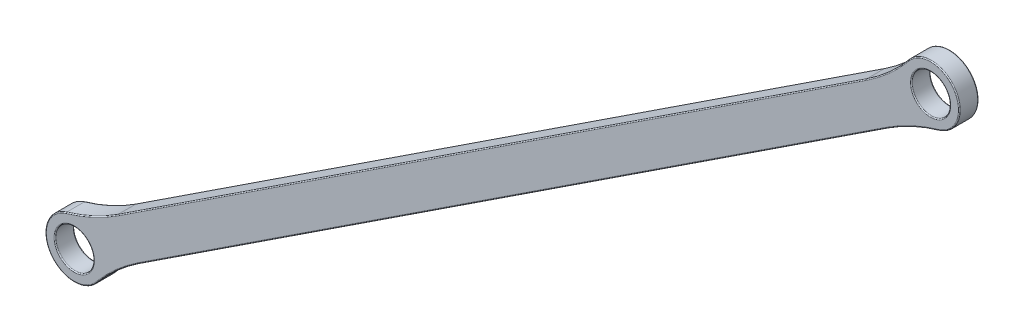
ISO-10303-21;
HEADER;
FILE_DESCRIPTION(('STEP AP214'),'2;1');
FILE_NAME('part.step','',(''),(''),'','','');
FILE_SCHEMA(('AUTOMOTIVE_DESIGN { 1 0 10303 214 1 1 1 1 }'));
ENDSEC;
DATA;
#1=APPLICATION_CONTEXT('core data for automotive mechanical design processes');
#2=APPLICATION_PROTOCOL_DEFINITION('international standard','automotive_design',2000,#1);
#3=PRODUCT_CONTEXT('',#1,'mechanical');
#4=PRODUCT('Part','Part','',(#3));
#5=PRODUCT_RELATED_PRODUCT_CATEGORY('part','',(#4));
#6=PRODUCT_DEFINITION_FORMATION('','',#4);
#7=PRODUCT_DEFINITION_CONTEXT('part definition',#1,'design');
#8=PRODUCT_DEFINITION('design','',#6,#7);
#9=PRODUCT_DEFINITION_SHAPE('','',#8);
#10=(LENGTH_UNIT() NAMED_UNIT(*) SI_UNIT(.MILLI.,.METRE.));
#11=(NAMED_UNIT(*) PLANE_ANGLE_UNIT() SI_UNIT($,.RADIAN.));
#12=(NAMED_UNIT(*) SI_UNIT($,.STERADIAN.) SOLID_ANGLE_UNIT());
#13=UNCERTAINTY_MEASURE_WITH_UNIT(LENGTH_MEASURE(1.E-05),#10,'distance_accuracy_value','');
#14=(GEOMETRIC_REPRESENTATION_CONTEXT(3) GLOBAL_UNCERTAINTY_ASSIGNED_CONTEXT((#13)) GLOBAL_UNIT_ASSIGNED_CONTEXT((#10,
#11,#12)) REPRESENTATION_CONTEXT('',''));
#15=CARTESIAN_POINT('',(0.,0.,0.));
#16=DIRECTION('',(0.,0.,1.));
#17=DIRECTION('',(1.,0.,0.));
#18=AXIS2_PLACEMENT_3D('',#15,#16,#17);
#19=CARTESIAN_POINT('',(-132.474102125265,201.706287235754,-3.));
#20=DIRECTION('',(0.548958656898151,-0.835849503808298,0.));
#21=DIRECTION('',(0.835849503808298,0.548958656898151,0.));
#22=AXIS2_PLACEMENT_3D('',#19,#20,#21);
#23=PLANE('',#22);
#24=DIRECTION('',(0.,0.,1.));
#25=VECTOR('',#24,1.);
#26=CARTESIAN_POINT('',(-101.185486117817,222.255628404699,-3.));
#27=LINE('',#26,#25);
#28=CARTESIAN_POINT('',(-101.185486117817,222.255628404699,-0.15));
#29=VERTEX_POINT('',#28);
#30=CARTESIAN_POINT('',(-101.185486117817,222.255628404699,-2.85));
#31=VERTEX_POINT('',#30);
#32=EDGE_CURVE('E314',#29,#31,#27,.F.);
#33=ORIENTED_EDGE('',*,*,#32,.T.);
#34=DIRECTION('',(0.835849503808298,0.548958656898151,0.));
#35=VECTOR('',#34,1.);
#36=CARTESIAN_POINT('',(-132.474102125265,201.706287235754,-2.85));
#37=LINE('',#36,#35);
#38=CARTESIAN_POINT('',(-218.100259941872,145.469823163946,-2.85));
#39=VERTEX_POINT('',#38);
#40=EDGE_CURVE('E214',#31,#39,#37,.F.);
#41=ORIENTED_EDGE('',*,*,#40,.T.);
#42=DIRECTION('',(0.,0.,1.));
#43=VECTOR('',#42,1.);
#44=CARTESIAN_POINT('',(-218.100259941872,145.469823163946,-3.));
#45=LINE('',#44,#43);
#46=CARTESIAN_POINT('',(-218.100259941872,145.469823163946,-0.15));
#47=VERTEX_POINT('',#46);
#48=EDGE_CURVE('E317',#39,#47,#45,.T.);
#49=ORIENTED_EDGE('',*,*,#48,.T.);
#50=DIRECTION('',(0.835849503808298,0.548958656898151,0.));
#51=VECTOR('',#50,1.);
#52=CARTESIAN_POINT('',(-101.185486117817,222.255628404699,-0.15));
#53=LINE('',#52,#51);
#54=EDGE_CURVE('E212',#47,#29,#53,.T.);
#55=ORIENTED_EDGE('',*,*,#54,.T.);
#56=EDGE_LOOP('',(#33,#41,#49,#55));
#57=FACE_BOUND('',#56,.T.);
#58=ADVANCED_FACE('F34',(#57),#23,.F.);
#59=CARTESIAN_POINT('',(-91.1280367544865,225.27186982475,-3.));
#60=DIRECTION('',(0.,0.,1.));
#61=DIRECTION('',(1.,0.,0.));
#62=AXIS2_PLACEMENT_3D('',#59,#60,#61);
#63=CYLINDRICAL_SURFACE('',#62,4.49999999999999);
#64=DIRECTION('',(0.,0.,1.));
#65=VECTOR('',#64,1.);
#66=CARTESIAN_POINT('',(-89.8621590651384,220.953588491208,-3.));
#67=LINE('',#66,#65);
#68=CARTESIAN_POINT('',(-89.8621590651384,220.953588491208,-0.15));
#69=VERTEX_POINT('',#68);
#70=CARTESIAN_POINT('',(-89.8621590651384,220.953588491208,-2.85));
#71=VERTEX_POINT('',#70);
#72=EDGE_CURVE('E311',#69,#71,#67,.F.);
#73=ORIENTED_EDGE('',*,*,#72,.T.);
#74=CARTESIAN_POINT('',(-91.1280367544865,225.27186982475,-2.85));
#75=DIRECTION('',(0.,0.,1.));
#76=DIRECTION('',(1.,0.,0.));
#77=AXIS2_PLACEMENT_3D('',#74,#75,#76);
#78=CIRCLE('',#77,4.49999999999999);
#79=CARTESIAN_POINT('',(-94.5879770680007,228.149162480515,-2.85));
#80=VERTEX_POINT('',#79);
#81=EDGE_CURVE('E205',#71,#80,#78,.T.);
#82=ORIENTED_EDGE('',*,*,#81,.T.);
#83=DIRECTION('',(0.,0.,1.));
#84=VECTOR('',#83,1.);
#85=CARTESIAN_POINT('',(-94.5879770680007,228.149162480515,-3.));
#86=LINE('',#85,#84);
#87=CARTESIAN_POINT('',(-94.5879770680007,228.149162480515,-0.15));
#88=VERTEX_POINT('',#87);
#89=EDGE_CURVE('E308',#80,#88,#86,.T.);
#90=ORIENTED_EDGE('',*,*,#89,.T.);
#91=CARTESIAN_POINT('',(-91.1280367544865,225.27186982475,-0.15));
#92=DIRECTION('',(0.,0.,1.));
#93=DIRECTION('',(1.,0.,0.));
#94=AXIS2_PLACEMENT_3D('',#91,#92,#93);
#95=CIRCLE('',#94,4.49999999999999);
#96=EDGE_CURVE('E203',#88,#69,#95,.F.);
#97=ORIENTED_EDGE('',*,*,#96,.T.);
#98=EDGE_LOOP('',(#73,#82,#90,#97));
#99=FACE_BOUND('',#98,.T.);
#100=ADVANCED_FACE('F386',(#99),#63,.T.);
#101=CARTESIAN_POINT('',(-129.180350183876,196.691190212904,-3.));
#102=DIRECTION('',(0.548958656898151,-0.835849503808298,0.));
#103=DIRECTION('',(0.835849503808298,0.548958656898151,0.));
#104=AXIS2_PLACEMENT_3D('',#101,#102,#103);
#105=PLANE('',#104);
#106=DIRECTION('',(0.,0.,-1.));
#107=VECTOR('',#106,1.);
#108=CARTESIAN_POINT('',(-214.806508000483,140.454726141096,-3.));
#109=LINE('',#108,#107);
#110=CARTESIAN_POINT('',(-214.806508000483,140.454726141096,-0.15));
#111=VERTEX_POINT('',#110);
#112=CARTESIAN_POINT('',(-214.806508000483,140.454726141096,-2.85));
#113=VERTEX_POINT('',#112);
#114=EDGE_CURVE('E296',#111,#113,#109,.T.);
#115=ORIENTED_EDGE('',*,*,#114,.T.);
#116=DIRECTION('',(0.835849503808298,0.548958656898151,0.));
#117=VECTOR('',#116,1.);
#118=CARTESIAN_POINT('',(-97.8917341764288,217.240531381849,-2.85));
#119=LINE('',#118,#117);
#120=CARTESIAN_POINT('',(-97.8917341764288,217.240531381849,-2.85));
#121=VERTEX_POINT('',#120);
#122=EDGE_CURVE('E197',#113,#121,#119,.T.);
#123=ORIENTED_EDGE('',*,*,#122,.T.);
#124=DIRECTION('',(0.,0.,-1.));
#125=VECTOR('',#124,1.);
#126=CARTESIAN_POINT('',(-97.8917341764288,217.240531381849,0.));
#127=LINE('',#126,#125);
#128=CARTESIAN_POINT('',(-97.8917341764288,217.240531381849,-0.15));
#129=VERTEX_POINT('',#128);
#130=EDGE_CURVE('E301',#121,#129,#127,.F.);
#131=ORIENTED_EDGE('',*,*,#130,.T.);
#132=DIRECTION('',(0.835849503808298,0.548958656898151,0.));
#133=VECTOR('',#132,1.);
#134=CARTESIAN_POINT('',(-129.180350183876,196.691190212904,-0.15));
#135=LINE('',#134,#133);
#136=EDGE_CURVE('E195',#129,#111,#135,.F.);
#137=ORIENTED_EDGE('',*,*,#136,.T.);
#138=EDGE_LOOP('',(#115,#123,#131,#137));
#139=FACE_BOUND('',#138,.T.);
#140=ADVANCED_FACE('F343',(#139),#105,.T.);
#141=CARTESIAN_POINT('',(-91.1280367544865,225.27186982475,-3.));
#142=DIRECTION('',(0.,0.,1.));
#143=DIRECTION('',(1.,0.,0.));
#144=AXIS2_PLACEMENT_3D('',#141,#142,#143);
#145=CYLINDRICAL_SURFACE('',#144,3.00000000000002);
#146=CARTESIAN_POINT('',(-91.1280367544865,225.27186982475,-2.85));
#147=DIRECTION('',(0.,0.,1.));
#148=DIRECTION('',(1.,0.,0.));
#149=AXIS2_PLACEMENT_3D('',#146,#147,#148);
#150=CIRCLE('',#149,3.00000000000002);
#151=CARTESIAN_POINT('',(-88.1280367544865,225.27186982475,-2.85));
#152=VERTEX_POINT('',#151);
#153=EDGE_CURVE('E189',#152,#152,#150,.F.);
#154=ORIENTED_EDGE('',*,*,#153,.T.);
#155=EDGE_LOOP('',(#154));
#156=FACE_BOUND('',#155,.T.);
#157=CARTESIAN_POINT('',(-91.1280367544865,225.27186982475,-0.15));
#158=DIRECTION('',(0.,0.,1.));
#159=DIRECTION('',(1.,0.,0.));
#160=AXIS2_PLACEMENT_3D('',#157,#158,#159);
#161=CIRCLE('',#160,3.00000000000002);
#162=CARTESIAN_POINT('',(-88.1280367544865,225.27186982475,-0.15));
#163=VERTEX_POINT('',#162);
#164=EDGE_CURVE('E186',#163,#163,#161,.T.);
#165=ORIENTED_EDGE('',*,*,#164,.T.);
#166=EDGE_LOOP('',(#165));
#167=FACE_BOUND('',#166,.T.);
#168=ADVANCED_FACE('F393',(#156,#167),#145,.F.);
#169=CARTESIAN_POINT('',(-224.863957363814,137.438484721045,-3.));
#170=DIRECTION('',(0.,0.,1.));
#171=DIRECTION('',(1.,0.,0.));
#172=AXIS2_PLACEMENT_3D('',#169,#170,#171);
#173=CYLINDRICAL_SURFACE('',#172,4.50000000000002);
#174=DIRECTION('',(0.,0.,1.));
#175=VECTOR('',#174,1.);
#176=CARTESIAN_POINT('',(-226.129835053162,141.756766054587,-3.));
#177=LINE('',#176,#175);
#178=CARTESIAN_POINT('',(-226.129835053162,141.756766054587,-0.15));
#179=VERTEX_POINT('',#178);
#180=CARTESIAN_POINT('',(-226.129835053162,141.756766054587,-2.85));
#181=VERTEX_POINT('',#180);
#182=EDGE_CURVE('E257',#179,#181,#177,.F.);
#183=ORIENTED_EDGE('',*,*,#182,.T.);
#184=CARTESIAN_POINT('',(-224.863957363814,137.438484721045,-2.85));
#185=DIRECTION('',(0.,0.,1.));
#186=DIRECTION('',(1.,0.,0.));
#187=AXIS2_PLACEMENT_3D('',#184,#185,#186);
#188=CIRCLE('',#187,4.50000000000002);
#189=CARTESIAN_POINT('',(-221.4040170503,134.56119206528,-2.85));
#190=VERTEX_POINT('',#189);
#191=EDGE_CURVE('E222',#181,#190,#188,.T.);
#192=ORIENTED_EDGE('',*,*,#191,.T.);
#193=DIRECTION('',(0.,0.,1.));
#194=VECTOR('',#193,1.);
#195=CARTESIAN_POINT('',(-221.4040170503,134.56119206528,-3.));
#196=LINE('',#195,#194);
#197=CARTESIAN_POINT('',(-221.4040170503,134.56119206528,-0.15));
#198=VERTEX_POINT('',#197);
#199=EDGE_CURVE('E294',#190,#198,#196,.T.);
#200=ORIENTED_EDGE('',*,*,#199,.T.);
#201=CARTESIAN_POINT('',(-224.863957363814,137.438484721045,-0.15));
#202=DIRECTION('',(0.,0.,1.));
#203=DIRECTION('',(1.,0.,0.));
#204=AXIS2_PLACEMENT_3D('',#201,#202,#203);
#205=CIRCLE('',#204,4.50000000000002);
#206=EDGE_CURVE('E220',#198,#179,#205,.F.);
#207=ORIENTED_EDGE('',*,*,#206,.T.);
#208=EDGE_LOOP('',(#183,#192,#200,#207));
#209=FACE_BOUND('',#208,.T.);
#210=ADVANCED_FACE('F299',(#209),#173,.T.);
#211=CARTESIAN_POINT('',(-224.863957363814,137.438484721045,-3.));
#212=DIRECTION('',(0.,0.,1.));
#213=DIRECTION('',(1.,0.,0.));
#214=AXIS2_PLACEMENT_3D('',#211,#212,#213);
#215=CYLINDRICAL_SURFACE('',#214,3.00000000000002);
#216=CARTESIAN_POINT('',(-224.863957363814,137.438484721045,-2.85));
#217=DIRECTION('',(0.,0.,1.));
#218=DIRECTION('',(1.,0.,0.));
#219=AXIS2_PLACEMENT_3D('',#216,#217,#218);
#220=CIRCLE('',#219,3.00000000000002);
#221=CARTESIAN_POINT('',(-221.863957363814,137.438484721045,-2.85));
#222=VERTEX_POINT('',#221);
#223=EDGE_CURVE('E169',#222,#222,#220,.F.);
#224=ORIENTED_EDGE('',*,*,#223,.T.);
#225=EDGE_LOOP('',(#224));
#226=FACE_BOUND('',#225,.T.);
#227=CARTESIAN_POINT('',(-224.863957363814,137.438484721045,-0.15));
#228=DIRECTION('',(0.,0.,1.));
#229=DIRECTION('',(1.,0.,0.));
#230=AXIS2_PLACEMENT_3D('',#227,#228,#229);
#231=CIRCLE('',#230,3.00000000000002);
#232=CARTESIAN_POINT('',(-221.863957363814,137.438484721045,-0.15));
#233=VERTEX_POINT('',#232);
#234=EDGE_CURVE('E320',#233,#233,#231,.T.);
#235=ORIENTED_EDGE('',*,*,#234,.T.);
#236=EDGE_LOOP('',(#235));
#237=FACE_BOUND('',#236,.T.);
#238=ADVANCED_FACE('F400',(#226,#237),#215,.F.);
#239=CARTESIAN_POINT('',(0.,0.,-3.));
#240=DIRECTION('',(0.,0.,1.));
#241=DIRECTION('',(1.,0.,0.));
#242=AXIS2_PLACEMENT_3D('',#239,#240,#241);
#243=PLANE('',#242);
#244=CARTESIAN_POINT('',(-224.863957363814,137.438484721045,-3.));
#245=DIRECTION('',(0.,0.,1.));
#246=DIRECTION('',(1.,0.,0.));
#247=AXIS2_PLACEMENT_3D('',#244,#245,#246);
#248=CIRCLE('',#247,3.15000000000002);
#249=CARTESIAN_POINT('',(-221.713957363814,137.438484721045,-3.));
#250=VERTEX_POINT('',#249);
#251=EDGE_CURVE('E178',#250,#250,#248,.T.);
#252=ORIENTED_EDGE('',*,*,#251,.T.);
#253=EDGE_LOOP('',(#252));
#254=FACE_BOUND('',#253,.T.);
#255=CARTESIAN_POINT('',(-91.1280367544865,225.27186982475,-3.));
#256=DIRECTION('',(0.,0.,1.));
#257=DIRECTION('',(1.,0.,0.));
#258=AXIS2_PLACEMENT_3D('',#255,#256,#257);
#259=CIRCLE('',#258,3.15000000000002);
#260=CARTESIAN_POINT('',(-87.9780367544865,225.27186982475,-3.));
#261=VERTEX_POINT('',#260);
#262=EDGE_CURVE('E175',#261,#261,#259,.T.);
#263=ORIENTED_EDGE('',*,*,#262,.T.);
#264=EDGE_LOOP('',(#263));
#265=FACE_BOUND('',#264,.T.);
#266=DIRECTION('',(0.835849503808298,0.548958656898151,0.));
#267=VECTOR('',#266,1.);
#268=CARTESIAN_POINT('',(-214.888851799018,140.580103566668,-3.));
#269=LINE('',#268,#267);
#270=CARTESIAN_POINT('',(-97.9740779749635,217.36590880742,-3.));
#271=VERTEX_POINT('',#270);
#272=CARTESIAN_POINT('',(-214.888851799018,140.580103566668,-3.));
#273=VERTEX_POINT('',#272);
#274=EDGE_CURVE('E173',#271,#273,#269,.F.);
#275=ORIENTED_EDGE('',*,*,#274,.T.);
#276=CARTESIAN_POINT('',(-198.337748293538,115.379241026847,-3.));
#277=DIRECTION('',(0.,0.,1.));
#278=DIRECTION('',(1.,0.,0.));
#279=AXIS2_PLACEMENT_3D('',#276,#277,#278);
#280=CIRCLE('',#279,30.15);
#281=CARTESIAN_POINT('',(-221.519348394084,134.657101820473,-3.));
#282=VERTEX_POINT('',#281);
#283=EDGE_CURVE('E154',#273,#282,#280,.T.);
#284=ORIENTED_EDGE('',*,*,#283,.T.);
#285=CARTESIAN_POINT('',(-224.863957363814,137.438484721045,-3.));
#286=DIRECTION('',(0.,0.,1.));
#287=DIRECTION('',(1.,0.,0.));
#288=AXIS2_PLACEMENT_3D('',#285,#286,#287);
#289=CIRCLE('',#288,4.35000000000002);
#290=CARTESIAN_POINT('',(-226.087639130184,141.612823343469,-3.));
#291=VERTEX_POINT('',#290);
#292=EDGE_CURVE('E162',#282,#291,#289,.F.);
#293=ORIENTED_EDGE('',*,*,#292,.T.);
#294=CARTESIAN_POINT('',(-234.569019648817,170.545308278195,-3.));
#295=DIRECTION('',(0.,0.,1.));
#296=DIRECTION('',(1.,0.,0.));
#297=AXIS2_PLACEMENT_3D('',#294,#295,#296);
#298=CIRCLE('',#297,30.15);
#299=CARTESIAN_POINT('',(-218.017916143337,145.344445738375,-3.));
#300=VERTEX_POINT('',#299);
#301=EDGE_CURVE('E168',#291,#300,#298,.T.);
#302=ORIENTED_EDGE('',*,*,#301,.T.);
#303=DIRECTION('',(0.835849503808298,0.548958656898151,0.));
#304=VECTOR('',#303,1.);
#305=CARTESIAN_POINT('',(-132.39175832673,201.580909810183,-3.));
#306=LINE('',#305,#304);
#307=CARTESIAN_POINT('',(-101.103142319283,222.130250979128,-3.));
#308=VERTEX_POINT('',#307);
#309=EDGE_CURVE('E326',#300,#308,#306,.T.);
#310=ORIENTED_EDGE('',*,*,#309,.T.);
#311=CARTESIAN_POINT('',(-117.654245824762,247.331113518948,-3.));
#312=DIRECTION('',(0.,0.,1.));
#313=DIRECTION('',(1.,0.,0.));
#314=AXIS2_PLACEMENT_3D('',#311,#312,#313);
#315=CIRCLE('',#314,30.15);
#316=CARTESIAN_POINT('',(-94.4726457242169,228.053252725322,-3.));
#317=VERTEX_POINT('',#316);
#318=EDGE_CURVE('E328',#308,#317,#315,.T.);
#319=ORIENTED_EDGE('',*,*,#318,.T.);
#320=CARTESIAN_POINT('',(-91.1280367544865,225.27186982475,-3.));
#321=DIRECTION('',(0.,0.,1.));
#322=DIRECTION('',(1.,0.,0.));
#323=AXIS2_PLACEMENT_3D('',#320,#321,#322);
#324=CIRCLE('',#323,4.34999999999999);
#325=CARTESIAN_POINT('',(-89.9043549881166,221.097531202326,-3.));
#326=VERTEX_POINT('',#325);
#327=EDGE_CURVE('E330',#317,#326,#324,.F.);
#328=ORIENTED_EDGE('',*,*,#327,.T.);
#329=CARTESIAN_POINT('',(-81.4229744694843,192.1650462676,-3.));
#330=DIRECTION('',(0.,0.,1.));
#331=DIRECTION('',(1.,0.,0.));
#332=AXIS2_PLACEMENT_3D('',#329,#330,#331);
#333=CIRCLE('',#332,30.15);
#334=EDGE_CURVE('E180',#326,#271,#333,.T.);
#335=ORIENTED_EDGE('',*,*,#334,.T.);
#336=EDGE_LOOP('',(#275,#284,#293,#302,#310,#319,#328,#335));
#337=FACE_BOUND('',#336,.T.);
#338=ADVANCED_FACE('F171',(#254,#265,#337),#243,.F.);
#339=CARTESIAN_POINT('',(0.,0.,0.));
#340=DIRECTION('',(0.,0.,1.));
#341=DIRECTION('',(1.,0.,0.));
#342=AXIS2_PLACEMENT_3D('',#339,#340,#341);
#343=PLANE('',#342);
#344=CARTESIAN_POINT('',(-224.863957363814,137.438484721045,0.));
#345=DIRECTION('',(0.,0.,1.));
#346=DIRECTION('',(1.,0.,0.));
#347=AXIS2_PLACEMENT_3D('',#344,#345,#346);
#348=CIRCLE('',#347,3.15000000000002);
#349=CARTESIAN_POINT('',(-221.713957363814,137.438484721045,0.));
#350=VERTEX_POINT('',#349);
#351=EDGE_CURVE('E11',#350,#350,#348,.F.);
#352=ORIENTED_EDGE('',*,*,#351,.T.);
#353=EDGE_LOOP('',(#352));
#354=FACE_BOUND('',#353,.T.);
#355=CARTESIAN_POINT('',(-91.1280367544865,225.27186982475,0.));
#356=DIRECTION('',(0.,0.,1.));
#357=DIRECTION('',(1.,0.,0.));
#358=AXIS2_PLACEMENT_3D('',#355,#356,#357);
#359=CIRCLE('',#358,3.15000000000002);
#360=CARTESIAN_POINT('',(-87.9780367544865,225.27186982475,0.));
#361=VERTEX_POINT('',#360);
#362=EDGE_CURVE('E43',#361,#361,#359,.F.);
#363=ORIENTED_EDGE('',*,*,#362,.T.);
#364=EDGE_LOOP('',(#363));
#365=FACE_BOUND('',#364,.T.);
#366=CARTESIAN_POINT('',(-91.1280367544865,225.27186982475,0.));
#367=DIRECTION('',(0.,0.,1.));
#368=DIRECTION('',(1.,0.,0.));
#369=AXIS2_PLACEMENT_3D('',#366,#367,#368);
#370=CIRCLE('',#369,4.34999999999999);
#371=CARTESIAN_POINT('',(-89.9043549881166,221.097531202326,0.));
#372=VERTEX_POINT('',#371);
#373=CARTESIAN_POINT('',(-94.4726457242169,228.053252725322,0.));
#374=VERTEX_POINT('',#373);
#375=EDGE_CURVE('E51',#372,#374,#370,.T.);
#376=ORIENTED_EDGE('',*,*,#375,.T.);
#377=CARTESIAN_POINT('',(-117.654245824762,247.331113518948,0.));
#378=DIRECTION('',(0.,0.,1.));
#379=DIRECTION('',(1.,0.,0.));
#380=AXIS2_PLACEMENT_3D('',#377,#378,#379);
#381=CIRCLE('',#380,30.15);
#382=CARTESIAN_POINT('',(-101.103142319283,222.130250979128,0.));
#383=VERTEX_POINT('',#382);
#384=EDGE_CURVE('E236',#374,#383,#381,.F.);
#385=ORIENTED_EDGE('',*,*,#384,.T.);
#386=DIRECTION('',(0.835849503808298,0.548958656898151,0.));
#387=VECTOR('',#386,1.);
#388=CARTESIAN_POINT('',(-218.017916143337,145.344445738375,0.));
#389=LINE('',#388,#387);
#390=CARTESIAN_POINT('',(-218.017916143337,145.344445738375,0.));
#391=VERTEX_POINT('',#390);
#392=EDGE_CURVE('E224',#383,#391,#389,.F.);
#393=ORIENTED_EDGE('',*,*,#392,.T.);
#394=CARTESIAN_POINT('',(-234.569019648817,170.545308278195,0.));
#395=DIRECTION('',(0.,0.,1.));
#396=DIRECTION('',(1.,0.,0.));
#397=AXIS2_PLACEMENT_3D('',#394,#395,#396);
#398=CIRCLE('',#397,30.15);
#399=CARTESIAN_POINT('',(-226.087639130184,141.612823343469,0.));
#400=VERTEX_POINT('',#399);
#401=EDGE_CURVE('E226',#391,#400,#398,.F.);
#402=ORIENTED_EDGE('',*,*,#401,.T.);
#403=CARTESIAN_POINT('',(-224.863957363814,137.438484721045,0.));
#404=DIRECTION('',(0.,0.,1.));
#405=DIRECTION('',(1.,0.,0.));
#406=AXIS2_PLACEMENT_3D('',#403,#404,#405);
#407=CIRCLE('',#406,4.35000000000002);
#408=CARTESIAN_POINT('',(-221.519348394084,134.657101820473,0.));
#409=VERTEX_POINT('',#408);
#410=EDGE_CURVE('E228',#400,#409,#407,.T.);
#411=ORIENTED_EDGE('',*,*,#410,.T.);
#412=CARTESIAN_POINT('',(-198.337748293538,115.379241026847,0.));
#413=DIRECTION('',(0.,0.,1.));
#414=DIRECTION('',(1.,0.,0.));
#415=AXIS2_PLACEMENT_3D('',#412,#413,#414);
#416=CIRCLE('',#415,30.15);
#417=CARTESIAN_POINT('',(-214.888851799018,140.580103566668,0.));
#418=VERTEX_POINT('',#417);
#419=EDGE_CURVE('E230',#409,#418,#416,.F.);
#420=ORIENTED_EDGE('',*,*,#419,.T.);
#421=DIRECTION('',(0.835849503808298,0.548958656898151,0.));
#422=VECTOR('',#421,1.);
#423=CARTESIAN_POINT('',(-129.26269398241,196.816567638476,0.));
#424=LINE('',#423,#422);
#425=CARTESIAN_POINT('',(-97.9740779749636,217.36590880742,0.));
#426=VERTEX_POINT('',#425);
#427=EDGE_CURVE('E232',#418,#426,#424,.T.);
#428=ORIENTED_EDGE('',*,*,#427,.T.);
#429=CARTESIAN_POINT('',(-81.4229744694843,192.1650462676,0.));
#430=DIRECTION('',(0.,0.,1.));
#431=DIRECTION('',(1.,0.,0.));
#432=AXIS2_PLACEMENT_3D('',#429,#430,#431);
#433=CIRCLE('',#432,30.15);
#434=EDGE_CURVE('E56',#426,#372,#433,.F.);
#435=ORIENTED_EDGE('',*,*,#434,.T.);
#436=EDGE_LOOP('',(#376,#385,#393,#402,#411,#420,#428,#435));
#437=FACE_BOUND('',#436,.T.);
#438=ADVANCED_FACE('F359',(#354,#365,#437),#343,.T.);
#439=CARTESIAN_POINT('',(-198.337748293538,115.379241026847,-3.));
#440=DIRECTION('',(0.,0.,1.));
#441=DIRECTION('',(1.,0.,0.));
#442=AXIS2_PLACEMENT_3D('',#439,#440,#441);
#443=CYLINDRICAL_SURFACE('',#442,30.);
#444=ORIENTED_EDGE('',*,*,#199,.F.);
#445=CARTESIAN_POINT('',(-198.337748293538,115.379241026847,-2.85));
#446=DIRECTION('',(0.,0.,1.));
#447=DIRECTION('',(1.,0.,0.));
#448=AXIS2_PLACEMENT_3D('',#445,#446,#447);
#449=CIRCLE('',#448,30.);
#450=EDGE_CURVE('E156',#190,#113,#449,.F.);
#451=ORIENTED_EDGE('',*,*,#450,.T.);
#452=ORIENTED_EDGE('',*,*,#114,.F.);
#453=CARTESIAN_POINT('',(-198.337748293538,115.379241026847,-0.15));
#454=DIRECTION('',(0.,0.,1.));
#455=DIRECTION('',(1.,0.,0.));
#456=AXIS2_PLACEMENT_3D('',#453,#454,#455);
#457=CIRCLE('',#456,30.);
#458=EDGE_CURVE('E192',#111,#198,#457,.T.);
#459=ORIENTED_EDGE('',*,*,#458,.T.);
#460=EDGE_LOOP('',(#444,#451,#452,#459));
#461=FACE_BOUND('',#460,.T.);
#462=ADVANCED_FACE('F293',(#461),#443,.F.);
#463=CARTESIAN_POINT('',(-81.4229744694843,192.1650462676,-3.));
#464=DIRECTION('',(0.,0.,1.));
#465=DIRECTION('',(1.,0.,0.));
#466=AXIS2_PLACEMENT_3D('',#463,#464,#465);
#467=CYLINDRICAL_SURFACE('',#466,30.);
#468=ORIENTED_EDGE('',*,*,#130,.F.);
#469=CARTESIAN_POINT('',(-81.4229744694843,192.1650462676,-2.85));
#470=DIRECTION('',(0.,0.,1.));
#471=DIRECTION('',(1.,0.,0.));
#472=AXIS2_PLACEMENT_3D('',#469,#470,#471);
#473=CIRCLE('',#472,30.);
#474=EDGE_CURVE('E201',#121,#71,#473,.F.);
#475=ORIENTED_EDGE('',*,*,#474,.T.);
#476=ORIENTED_EDGE('',*,*,#72,.F.);
#477=CARTESIAN_POINT('',(-81.4229744694843,192.1650462676,-0.15));
#478=DIRECTION('',(0.,0.,1.));
#479=DIRECTION('',(1.,0.,0.));
#480=AXIS2_PLACEMENT_3D('',#477,#478,#479);
#481=CIRCLE('',#480,30.);
#482=EDGE_CURVE('E199',#69,#129,#481,.T.);
#483=ORIENTED_EDGE('',*,*,#482,.T.);
#484=EDGE_LOOP('',(#468,#475,#476,#483));
#485=FACE_BOUND('',#484,.T.);
#486=ADVANCED_FACE('F345',(#485),#467,.F.);
#487=CARTESIAN_POINT('',(-234.569019648817,170.545308278195,-3.));
#488=DIRECTION('',(0.,0.,1.));
#489=DIRECTION('',(1.,0.,0.));
#490=AXIS2_PLACEMENT_3D('',#487,#488,#489);
#491=CYLINDRICAL_SURFACE('',#490,30.);
#492=ORIENTED_EDGE('',*,*,#48,.F.);
#493=CARTESIAN_POINT('',(-234.569019648817,170.545308278195,-2.85));
#494=DIRECTION('',(0.,0.,1.));
#495=DIRECTION('',(1.,0.,0.));
#496=AXIS2_PLACEMENT_3D('',#493,#494,#495);
#497=CIRCLE('',#496,30.);
#498=EDGE_CURVE('E218',#39,#181,#497,.F.);
#499=ORIENTED_EDGE('',*,*,#498,.T.);
#500=ORIENTED_EDGE('',*,*,#182,.F.);
#501=CARTESIAN_POINT('',(-234.569019648817,170.545308278195,-0.15));
#502=DIRECTION('',(0.,0.,1.));
#503=DIRECTION('',(1.,0.,0.));
#504=AXIS2_PLACEMENT_3D('',#501,#502,#503);
#505=CIRCLE('',#504,30.);
#506=EDGE_CURVE('E216',#179,#47,#505,.T.);
#507=ORIENTED_EDGE('',*,*,#506,.T.);
#508=EDGE_LOOP('',(#492,#499,#500,#507));
#509=FACE_BOUND('',#508,.T.);
#510=ADVANCED_FACE('F406',(#509),#491,.F.);
#511=CARTESIAN_POINT('',(-117.654245824762,247.331113518948,-3.));
#512=DIRECTION('',(0.,0.,1.));
#513=DIRECTION('',(1.,0.,0.));
#514=AXIS2_PLACEMENT_3D('',#511,#512,#513);
#515=CYLINDRICAL_SURFACE('',#514,30.);
#516=ORIENTED_EDGE('',*,*,#89,.F.);
#517=CARTESIAN_POINT('',(-117.654245824762,247.331113518948,-2.85));
#518=DIRECTION('',(0.,0.,1.));
#519=DIRECTION('',(1.,0.,0.));
#520=AXIS2_PLACEMENT_3D('',#517,#518,#519);
#521=CIRCLE('',#520,30.);
#522=EDGE_CURVE('E210',#80,#31,#521,.F.);
#523=ORIENTED_EDGE('',*,*,#522,.T.);
#524=ORIENTED_EDGE('',*,*,#32,.F.);
#525=CARTESIAN_POINT('',(-117.654245824762,247.331113518948,-0.15));
#526=DIRECTION('',(0.,0.,1.));
#527=DIRECTION('',(1.,0.,0.));
#528=AXIS2_PLACEMENT_3D('',#525,#526,#527);
#529=CIRCLE('',#528,30.);
#530=EDGE_CURVE('E207',#29,#88,#529,.T.);
#531=ORIENTED_EDGE('',*,*,#530,.T.);
#532=EDGE_LOOP('',(#516,#523,#524,#531));
#533=FACE_BOUND('',#532,.T.);
#534=ADVANCED_FACE('F375',(#533),#515,.F.);
#535=CARTESIAN_POINT('',(-224.863957363814,137.438484721045,-2.85));
#536=DIRECTION('',(0.,0.,1.));
#537=DIRECTION('',(1.,0.,0.));
#538=AXIS2_PLACEMENT_3D('',#535,#536,#537);
#539=TOROIDAL_SURFACE('',#538,3.15000000000002,0.15);
#540=ORIENTED_EDGE('',*,*,#251,.F.);
#541=EDGE_LOOP('',(#540));
#542=FACE_BOUND('',#541,.T.);
#543=ORIENTED_EDGE('',*,*,#223,.F.);
#544=EDGE_LOOP('',(#543));
#545=FACE_BOUND('',#544,.T.);
#546=ADVANCED_FACE('F412',(#542,#545),#539,.T.);
#547=CARTESIAN_POINT('',(-91.1280367544865,225.27186982475,-2.85));
#548=DIRECTION('',(0.,0.,1.));
#549=DIRECTION('',(1.,0.,0.));
#550=AXIS2_PLACEMENT_3D('',#547,#548,#549);
#551=TOROIDAL_SURFACE('',#550,3.15000000000002,0.15);
#552=ORIENTED_EDGE('',*,*,#153,.F.);
#553=EDGE_LOOP('',(#552));
#554=FACE_BOUND('',#553,.T.);
#555=ORIENTED_EDGE('',*,*,#262,.F.);
#556=EDGE_LOOP('',(#555));
#557=FACE_BOUND('',#556,.T.);
#558=ADVANCED_FACE('F415',(#554,#557),#551,.T.);
#559=CARTESIAN_POINT('',(-117.654245824762,247.331113518948,-2.85));
#560=DIRECTION('',(0.,0.,1.));
#561=DIRECTION('',(1.,0.,0.));
#562=AXIS2_PLACEMENT_3D('',#559,#560,#561);
#563=TOROIDAL_SURFACE('',#562,30.15,0.15);
#564=CARTESIAN_POINT('',(-101.103142319283,222.130250979128,-2.85));
#565=DIRECTION('',(-0.835849503808317,-0.548958656898122,0.));
#566=DIRECTION('',(0.548958656898122,-0.835849503808317,0.));
#567=AXIS2_PLACEMENT_3D('',#564,#565,#566);
#568=CIRCLE('',#567,0.15);
#569=EDGE_CURVE('E251',#31,#308,#568,.T.);
#570=ORIENTED_EDGE('',*,*,#569,.F.);
#571=ORIENTED_EDGE('',*,*,#522,.F.);
#572=CARTESIAN_POINT('',(-94.4726457242169,228.053252725322,-2.85));
#573=DIRECTION('',(0.639398367947779,0.768875625225378,0.));
#574=DIRECTION('',(-0.768875625225379,0.639398367947779,0.));
#575=AXIS2_PLACEMENT_3D('',#572,#573,#574);
#576=CIRCLE('',#575,0.15);
#577=EDGE_CURVE('E254',#317,#80,#576,.T.);
#578=ORIENTED_EDGE('',*,*,#577,.F.);
#579=ORIENTED_EDGE('',*,*,#318,.F.);
#580=EDGE_LOOP('',(#570,#571,#578,#579));
#581=FACE_BOUND('',#580,.T.);
#582=ADVANCED_FACE('F379',(#581),#563,.T.);
#583=CARTESIAN_POINT('',(-91.1280367544865,225.27186982475,-2.85));
#584=DIRECTION('',(0.,0.,1.));
#585=DIRECTION('',(1.,0.,0.));
#586=AXIS2_PLACEMENT_3D('',#583,#584,#585);
#587=TOROIDAL_SURFACE('',#586,4.34999999999999,0.15);
#588=ORIENTED_EDGE('',*,*,#577,.T.);
#589=ORIENTED_EDGE('',*,*,#81,.F.);
#590=CARTESIAN_POINT('',(-89.9043549881166,221.097531202326,-2.85));
#591=DIRECTION('',(-0.959618074120268,-0.281306153188493,0.));
#592=DIRECTION('',(0.281306153188493,-0.959618074120268,0.));
#593=AXIS2_PLACEMENT_3D('',#590,#591,#592);
#594=CIRCLE('',#593,0.15);
#595=EDGE_CURVE('E248',#326,#71,#594,.T.);
#596=ORIENTED_EDGE('',*,*,#595,.F.);
#597=ORIENTED_EDGE('',*,*,#327,.F.);
#598=EDGE_LOOP('',(#588,#589,#596,#597));
#599=FACE_BOUND('',#598,.T.);
#600=ADVANCED_FACE('F384',(#599),#587,.T.);
#601=CARTESIAN_POINT('',(-132.39175832673,201.580909810183,-2.85));
#602=DIRECTION('',(0.835849503808298,0.548958656898151,0.));
#603=DIRECTION('',(-0.548958656898151,0.835849503808298,0.));
#604=AXIS2_PLACEMENT_3D('',#601,#602,#603);
#605=CYLINDRICAL_SURFACE('',#604,0.15);
#606=ORIENTED_EDGE('',*,*,#569,.T.);
#607=ORIENTED_EDGE('',*,*,#309,.F.);
#608=CARTESIAN_POINT('',(-218.017916143337,145.344445738375,-2.85));
#609=DIRECTION('',(-0.835849503808317,-0.548958656898122,0.));
#610=DIRECTION('',(0.548958656898122,-0.835849503808317,0.));
#611=AXIS2_PLACEMENT_3D('',#608,#609,#610);
#612=CIRCLE('',#611,0.15);
#613=EDGE_CURVE('E245',#39,#300,#612,.T.);
#614=ORIENTED_EDGE('',*,*,#613,.F.);
#615=ORIENTED_EDGE('',*,*,#40,.F.);
#616=EDGE_LOOP('',(#606,#607,#614,#615));
#617=FACE_BOUND('',#616,.T.);
#618=ADVANCED_FACE('F433',(#617),#605,.T.);
#619=CARTESIAN_POINT('',(-81.4229744694843,192.1650462676,-2.85));
#620=DIRECTION('',(0.,0.,1.));
#621=DIRECTION('',(1.,0.,0.));
#622=AXIS2_PLACEMENT_3D('',#619,#620,#621);
#623=TOROIDAL_SURFACE('',#622,30.15,0.15);
#624=ORIENTED_EDGE('',*,*,#595,.T.);
#625=ORIENTED_EDGE('',*,*,#474,.F.);
#626=CARTESIAN_POINT('',(-97.9740779749635,217.36590880742,-2.85));
#627=DIRECTION('',(-0.835849503808304,-0.548958656898142,0.));
#628=DIRECTION('',(0.548958656898143,-0.835849503808304,0.));
#629=AXIS2_PLACEMENT_3D('',#626,#627,#628);
#630=CIRCLE('',#629,0.15);
#631=EDGE_CURVE('E242',#271,#121,#630,.T.);
#632=ORIENTED_EDGE('',*,*,#631,.F.);
#633=ORIENTED_EDGE('',*,*,#334,.F.);
#634=EDGE_LOOP('',(#624,#625,#632,#633));
#635=FACE_BOUND('',#634,.T.);
#636=ADVANCED_FACE('F337',(#635),#623,.T.);
#637=CARTESIAN_POINT('',(-234.569019648817,170.545308278195,-2.85));
#638=DIRECTION('',(0.,0.,1.));
#639=DIRECTION('',(1.,0.,0.));
#640=AXIS2_PLACEMENT_3D('',#637,#638,#639);
#641=TOROIDAL_SURFACE('',#640,30.15,0.15);
#642=ORIENTED_EDGE('',*,*,#613,.T.);
#643=ORIENTED_EDGE('',*,*,#301,.F.);
#644=CARTESIAN_POINT('',(-226.087639130184,141.612823343469,-2.85));
#645=DIRECTION('',(-0.959618074120268,-0.281306153188493,0.));
#646=DIRECTION('',(0.281306153188493,-0.959618074120268,0.));
#647=AXIS2_PLACEMENT_3D('',#644,#645,#646);
#648=CIRCLE('',#647,0.15);
#649=EDGE_CURVE('E165',#181,#291,#648,.T.);
#650=ORIENTED_EDGE('',*,*,#649,.F.);
#651=ORIENTED_EDGE('',*,*,#498,.F.);
#652=EDGE_LOOP('',(#642,#643,#650,#651));
#653=FACE_BOUND('',#652,.T.);
#654=ADVANCED_FACE('F427',(#653),#641,.T.);
#655=CARTESIAN_POINT('',(-129.26269398241,196.816567638475,-2.85));
#656=DIRECTION('',(-0.835849503808298,-0.548958656898151,0.));
#657=DIRECTION('',(0.548958656898151,-0.835849503808298,0.));
#658=AXIS2_PLACEMENT_3D('',#655,#656,#657);
#659=CYLINDRICAL_SURFACE('',#658,0.15);
#660=ORIENTED_EDGE('',*,*,#631,.T.);
#661=ORIENTED_EDGE('',*,*,#122,.F.);
#662=CARTESIAN_POINT('',(-214.888851799018,140.580103566668,-2.85));
#663=DIRECTION('',(-0.835849503808458,-0.548958656897908,0.));
#664=DIRECTION('',(0.548958656897908,-0.835849503808458,0.));
#665=AXIS2_PLACEMENT_3D('',#662,#663,#664);
#666=CIRCLE('',#665,0.15);
#667=EDGE_CURVE('E159',#273,#113,#666,.T.);
#668=ORIENTED_EDGE('',*,*,#667,.F.);
#669=ORIENTED_EDGE('',*,*,#274,.F.);
#670=EDGE_LOOP('',(#660,#661,#668,#669));
#671=FACE_BOUND('',#670,.T.);
#672=ADVANCED_FACE('F340',(#671),#659,.T.);
#673=CARTESIAN_POINT('',(-224.863957363814,137.438484721045,-2.85));
#674=DIRECTION('',(0.,0.,1.));
#675=DIRECTION('',(1.,0.,0.));
#676=AXIS2_PLACEMENT_3D('',#673,#674,#675);
#677=TOROIDAL_SURFACE('',#676,4.35000000000002,0.15);
#678=ORIENTED_EDGE('',*,*,#649,.T.);
#679=ORIENTED_EDGE('',*,*,#292,.F.);
#680=CARTESIAN_POINT('',(-221.519348394084,134.657101820473,-2.85));
#681=DIRECTION('',(0.639398367947779,0.768875625225378,0.));
#682=DIRECTION('',(-0.768875625225379,0.639398367947779,0.));
#683=AXIS2_PLACEMENT_3D('',#680,#681,#682);
#684=CIRCLE('',#683,0.15);
#685=EDGE_CURVE('E150',#190,#282,#684,.T.);
#686=ORIENTED_EDGE('',*,*,#685,.F.);
#687=ORIENTED_EDGE('',*,*,#191,.F.);
#688=EDGE_LOOP('',(#678,#679,#686,#687));
#689=FACE_BOUND('',#688,.T.);
#690=ADVANCED_FACE('F163',(#689),#677,.T.);
#691=CARTESIAN_POINT('',(-198.337748293538,115.379241026847,-2.85));
#692=DIRECTION('',(0.,0.,1.));
#693=DIRECTION('',(1.,0.,0.));
#694=AXIS2_PLACEMENT_3D('',#691,#692,#693);
#695=TOROIDAL_SURFACE('',#694,30.15,0.15);
#696=ORIENTED_EDGE('',*,*,#667,.T.);
#697=ORIENTED_EDGE('',*,*,#450,.F.);
#698=ORIENTED_EDGE('',*,*,#685,.T.);
#699=ORIENTED_EDGE('',*,*,#283,.F.);
#700=EDGE_LOOP('',(#696,#697,#698,#699));
#701=FACE_BOUND('',#700,.T.);
#702=ADVANCED_FACE('F152',(#701),#695,.T.);
#703=CARTESIAN_POINT('',(-224.863957363814,137.438484721045,-0.15));
#704=DIRECTION('',(0.,0.,1.));
#705=DIRECTION('',(1.,0.,0.));
#706=AXIS2_PLACEMENT_3D('',#703,#704,#705);
#707=TOROIDAL_SURFACE('',#706,3.15000000000002,0.15);
#708=ORIENTED_EDGE('',*,*,#234,.F.);
#709=EDGE_LOOP('',(#708));
#710=FACE_BOUND('',#709,.T.);
#711=ORIENTED_EDGE('',*,*,#351,.F.);
#712=EDGE_LOOP('',(#711));
#713=FACE_BOUND('',#712,.T.);
#714=ADVANCED_FACE('F422',(#710,#713),#707,.T.);
#715=CARTESIAN_POINT('',(-91.1280367544865,225.27186982475,-0.15));
#716=DIRECTION('',(0.,0.,1.));
#717=DIRECTION('',(1.,0.,0.));
#718=AXIS2_PLACEMENT_3D('',#715,#716,#717);
#719=TOROIDAL_SURFACE('',#718,3.15000000000002,0.15);
#720=ORIENTED_EDGE('',*,*,#362,.F.);
#721=EDGE_LOOP('',(#720));
#722=FACE_BOUND('',#721,.T.);
#723=ORIENTED_EDGE('',*,*,#164,.F.);
#724=EDGE_LOOP('',(#723));
#725=FACE_BOUND('',#724,.T.);
#726=ADVANCED_FACE('F443',(#722,#725),#719,.T.);
#727=CARTESIAN_POINT('',(-198.337748293538,115.379241026847,-0.15));
#728=DIRECTION('',(0.,0.,1.));
#729=DIRECTION('',(1.,0.,0.));
#730=AXIS2_PLACEMENT_3D('',#727,#728,#729);
#731=TOROIDAL_SURFACE('',#730,30.15,0.15);
#732=CARTESIAN_POINT('',(-221.519348394084,134.657101820473,-0.15));
#733=DIRECTION('',(-0.639398367947779,-0.768875625225378,0.));
#734=DIRECTION('',(0.768875625225379,-0.639398367947779,0.));
#735=AXIS2_PLACEMENT_3D('',#732,#733,#734);
#736=CIRCLE('',#735,0.15);
#737=EDGE_CURVE('E273',#198,#409,#736,.T.);
#738=ORIENTED_EDGE('',*,*,#737,.F.);
#739=ORIENTED_EDGE('',*,*,#458,.F.);
#740=CARTESIAN_POINT('',(-214.888851799018,140.580103566668,-0.15));
#741=DIRECTION('',(0.835849503808176,0.548958656898336,0.));
#742=DIRECTION('',(-0.548958656898336,0.835849503808176,0.));
#743=AXIS2_PLACEMENT_3D('',#740,#741,#742);
#744=CIRCLE('',#743,0.15);
#745=EDGE_CURVE('E38',#418,#111,#744,.T.);
#746=ORIENTED_EDGE('',*,*,#745,.F.);
#747=ORIENTED_EDGE('',*,*,#419,.F.);
#748=EDGE_LOOP('',(#738,#739,#746,#747));
#749=FACE_BOUND('',#748,.T.);
#750=ADVANCED_FACE('F36',(#749),#731,.T.);
#751=CARTESIAN_POINT('',(-129.26269398241,196.816567638476,-0.15));
#752=DIRECTION('',(0.835849503808298,0.548958656898151,0.));
#753=DIRECTION('',(-0.548958656898151,0.835849503808298,0.));
#754=AXIS2_PLACEMENT_3D('',#751,#752,#753);
#755=CYLINDRICAL_SURFACE('',#754,0.15);
#756=ORIENTED_EDGE('',*,*,#745,.T.);
#757=ORIENTED_EDGE('',*,*,#136,.F.);
#758=CARTESIAN_POINT('',(-97.9740779749636,217.36590880742,-0.15));
#759=DIRECTION('',(0.835849503808274,0.548958656898187,0.));
#760=DIRECTION('',(-0.548958656898187,0.835849503808274,0.));
#761=AXIS2_PLACEMENT_3D('',#758,#759,#760);
#762=CIRCLE('',#761,0.15);
#763=EDGE_CURVE('E271',#426,#129,#762,.T.);
#764=ORIENTED_EDGE('',*,*,#763,.F.);
#765=ORIENTED_EDGE('',*,*,#427,.F.);
#766=EDGE_LOOP('',(#756,#757,#764,#765));
#767=FACE_BOUND('',#766,.T.);
#768=ADVANCED_FACE('F284',(#767),#755,.T.);
#769=CARTESIAN_POINT('',(-224.863957363814,137.438484721045,-0.15));
#770=DIRECTION('',(0.,0.,1.));
#771=DIRECTION('',(1.,0.,0.));
#772=AXIS2_PLACEMENT_3D('',#769,#770,#771);
#773=TOROIDAL_SURFACE('',#772,4.35000000000002,0.15);
#774=ORIENTED_EDGE('',*,*,#737,.T.);
#775=ORIENTED_EDGE('',*,*,#410,.F.);
#776=CARTESIAN_POINT('',(-226.087639130184,141.612823343469,-0.15));
#777=DIRECTION('',(0.959618074120268,0.281306153188493,0.));
#778=DIRECTION('',(-0.281306153188493,0.959618074120268,0.));
#779=AXIS2_PLACEMENT_3D('',#776,#777,#778);
#780=CIRCLE('',#779,0.15);
#781=EDGE_CURVE('E268',#179,#400,#780,.T.);
#782=ORIENTED_EDGE('',*,*,#781,.F.);
#783=ORIENTED_EDGE('',*,*,#206,.F.);
#784=EDGE_LOOP('',(#774,#775,#782,#783));
#785=FACE_BOUND('',#784,.T.);
#786=ADVANCED_FACE('F458',(#785),#773,.T.);
#787=CARTESIAN_POINT('',(-81.4229744694843,192.1650462676,-0.15));
#788=DIRECTION('',(0.,0.,1.));
#789=DIRECTION('',(1.,0.,0.));
#790=AXIS2_PLACEMENT_3D('',#787,#788,#789);
#791=TOROIDAL_SURFACE('',#790,30.15,0.15);
#792=ORIENTED_EDGE('',*,*,#763,.T.);
#793=ORIENTED_EDGE('',*,*,#482,.F.);
#794=CARTESIAN_POINT('',(-89.9043549881166,221.097531202326,-0.15));
#795=DIRECTION('',(0.959618074120283,0.281306153188443,0.));
#796=DIRECTION('',(-0.281306153188443,0.959618074120283,0.));
#797=AXIS2_PLACEMENT_3D('',#794,#795,#796);
#798=CIRCLE('',#797,0.15);
#799=EDGE_CURVE('E265',#372,#69,#798,.T.);
#800=ORIENTED_EDGE('',*,*,#799,.F.);
#801=ORIENTED_EDGE('',*,*,#434,.F.);
#802=EDGE_LOOP('',(#792,#793,#800,#801));
#803=FACE_BOUND('',#802,.T.);
#804=ADVANCED_FACE('F349',(#803),#791,.T.);
#805=CARTESIAN_POINT('',(-234.569019648817,170.545308278195,-0.15));
#806=DIRECTION('',(0.,0.,1.));
#807=DIRECTION('',(1.,0.,0.));
#808=AXIS2_PLACEMENT_3D('',#805,#806,#807);
#809=TOROIDAL_SURFACE('',#808,30.15,0.15);
#810=ORIENTED_EDGE('',*,*,#781,.T.);
#811=ORIENTED_EDGE('',*,*,#401,.F.);
#812=CARTESIAN_POINT('',(-218.017916143337,145.344445738375,-0.15));
#813=DIRECTION('',(0.835849503808317,0.548958656898122,-1.01577756742599E-13));
#814=DIRECTION('',(-0.548958656898122,0.835849503808317,0.));
#815=AXIS2_PLACEMENT_3D('',#812,#813,#814);
#816=CIRCLE('',#815,0.15);
#817=EDGE_CURVE('E262',#47,#391,#816,.T.);
#818=ORIENTED_EDGE('',*,*,#817,.F.);
#819=ORIENTED_EDGE('',*,*,#506,.F.);
#820=EDGE_LOOP('',(#810,#811,#818,#819));
#821=FACE_BOUND('',#820,.T.);
#822=ADVANCED_FACE('F364',(#821),#809,.T.);
#823=CARTESIAN_POINT('',(-91.1280367544865,225.27186982475,-0.15));
#824=DIRECTION('',(0.,0.,1.));
#825=DIRECTION('',(1.,0.,0.));
#826=AXIS2_PLACEMENT_3D('',#823,#824,#825);
#827=TOROIDAL_SURFACE('',#826,4.34999999999999,0.15);
#828=ORIENTED_EDGE('',*,*,#799,.T.);
#829=ORIENTED_EDGE('',*,*,#96,.F.);
#830=CARTESIAN_POINT('',(-94.4726457242169,228.053252725322,-0.15));
#831=DIRECTION('',(-0.639398367947779,-0.768875625225379,0.));
#832=DIRECTION('',(0.768875625225379,-0.639398367947779,0.));
#833=AXIS2_PLACEMENT_3D('',#830,#831,#832);
#834=CIRCLE('',#833,0.15);
#835=EDGE_CURVE('E260',#374,#88,#834,.T.);
#836=ORIENTED_EDGE('',*,*,#835,.F.);
#837=ORIENTED_EDGE('',*,*,#375,.F.);
#838=EDGE_LOOP('',(#828,#829,#836,#837));
#839=FACE_BOUND('',#838,.T.);
#840=ADVANCED_FACE('F352',(#839),#827,.T.);
#841=CARTESIAN_POINT('',(-132.39175832673,201.580909810183,-0.15));
#842=DIRECTION('',(-0.835849503808298,-0.548958656898151,0.));
#843=DIRECTION('',(0.548958656898151,-0.835849503808298,0.));
#844=AXIS2_PLACEMENT_3D('',#841,#842,#843);
#845=CYLINDRICAL_SURFACE('',#844,0.15);
#846=ORIENTED_EDGE('',*,*,#817,.T.);
#847=ORIENTED_EDGE('',*,*,#392,.F.);
#848=CARTESIAN_POINT('',(-101.103142319283,222.130250979128,-0.15));
#849=DIRECTION('',(0.835849503808317,0.548958656898122,1.01577756742599E-13));
#850=DIRECTION('',(-0.548958656898122,0.835849503808317,0.));
#851=AXIS2_PLACEMENT_3D('',#848,#849,#850);
#852=CIRCLE('',#851,0.15);
#853=EDGE_CURVE('E258',#29,#383,#852,.T.);
#854=ORIENTED_EDGE('',*,*,#853,.F.);
#855=ORIENTED_EDGE('',*,*,#54,.F.);
#856=EDGE_LOOP('',(#846,#847,#854,#855));
#857=FACE_BOUND('',#856,.T.);
#858=ADVANCED_FACE('F368',(#857),#845,.T.);
#859=CARTESIAN_POINT('',(-117.654245824762,247.331113518948,-0.15));
#860=DIRECTION('',(0.,0.,1.));
#861=DIRECTION('',(1.,0.,0.));
#862=AXIS2_PLACEMENT_3D('',#859,#860,#861);
#863=TOROIDAL_SURFACE('',#862,30.15,0.15);
#864=ORIENTED_EDGE('',*,*,#835,.T.);
#865=ORIENTED_EDGE('',*,*,#530,.F.);
#866=ORIENTED_EDGE('',*,*,#853,.T.);
#867=ORIENTED_EDGE('',*,*,#384,.F.);
#868=EDGE_LOOP('',(#864,#865,#866,#867));
#869=FACE_BOUND('',#868,.T.);
#870=ADVANCED_FACE('F356',(#869),#863,.T.);
#871=CLOSED_SHELL('',(#58,#100,#140,#168,#210,#238,#338,#438,#462,#486,#510,#534,#546,#558,#582,
#600,#618,#636,#654,#672,#690,#702,#714,#726,#750,#768,#786,#804,#822,#840,#858,#870));
#872=MANIFOLD_SOLID_BREP('B2',#871);
#873=ADVANCED_BREP_SHAPE_REPRESENTATION('',(#18,#872),#14);
#874=SHAPE_DEFINITION_REPRESENTATION(#9,#873);
ENDSEC;
END-ISO-10303-21;
